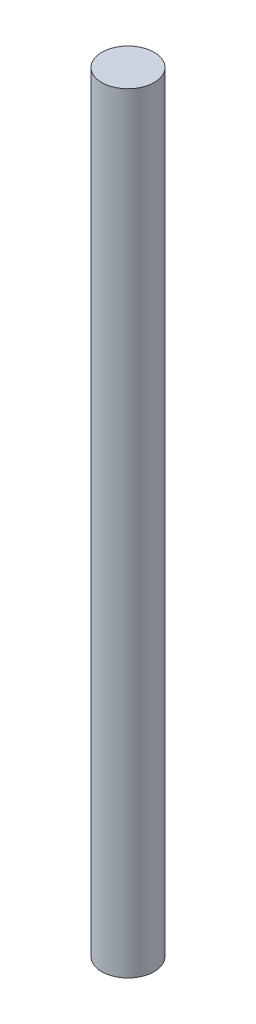
ISO-10303-21;
HEADER;
FILE_DESCRIPTION(('STEP AP214'),'2;1');
FILE_NAME('part.step','',(''),(''),'','','');
FILE_SCHEMA(('AUTOMOTIVE_DESIGN { 1 0 10303 214 1 1 1 1 }'));
ENDSEC;
DATA;
#1=APPLICATION_CONTEXT('core data for automotive mechanical design processes');
#2=APPLICATION_PROTOCOL_DEFINITION('international standard','automotive_design',2000,#1);
#3=PRODUCT_CONTEXT('',#1,'mechanical');
#4=PRODUCT('Part','Part','',(#3));
#5=PRODUCT_RELATED_PRODUCT_CATEGORY('part','',(#4));
#6=PRODUCT_DEFINITION_FORMATION('','',#4);
#7=PRODUCT_DEFINITION_CONTEXT('part definition',#1,'design');
#8=PRODUCT_DEFINITION('design','',#6,#7);
#9=PRODUCT_DEFINITION_SHAPE('','',#8);
#10=(LENGTH_UNIT() NAMED_UNIT(*) SI_UNIT(.MILLI.,.METRE.));
#11=(NAMED_UNIT(*) PLANE_ANGLE_UNIT() SI_UNIT($,.RADIAN.));
#12=(NAMED_UNIT(*) SI_UNIT($,.STERADIAN.) SOLID_ANGLE_UNIT());
#13=UNCERTAINTY_MEASURE_WITH_UNIT(LENGTH_MEASURE(1.E-05),#10,'distance_accuracy_value','');
#14=(GEOMETRIC_REPRESENTATION_CONTEXT(3) GLOBAL_UNCERTAINTY_ASSIGNED_CONTEXT((#13)) GLOBAL_UNIT_ASSIGNED_CONTEXT((#10,
#11,#12)) REPRESENTATION_CONTEXT('',''));
#15=CARTESIAN_POINT('',(0.,0.,0.));
#16=DIRECTION('',(0.,0.,1.));
#17=DIRECTION('',(1.,0.,0.));
#18=AXIS2_PLACEMENT_3D('',#15,#16,#17);
#19=CARTESIAN_POINT('',(0.,140.,0.));
#20=DIRECTION('',(0.,-1.,0.));
#21=DIRECTION('',(0.,0.,-1.));
#22=AXIS2_PLACEMENT_3D('',#19,#20,#21);
#23=CYLINDRICAL_SURFACE('',#22,4.7625);
#24=CARTESIAN_POINT('',(0.,140.,0.));
#25=DIRECTION('',(0.,1.,0.));
#26=DIRECTION('',(0.,0.,1.));
#27=AXIS2_PLACEMENT_3D('',#24,#25,#26);
#28=CIRCLE('',#27,4.7625);
#29=CARTESIAN_POINT('',(0.,140.,4.7625));
#30=VERTEX_POINT('',#29);
#31=EDGE_CURVE('E10',#30,#30,#28,.T.);
#32=ORIENTED_EDGE('',*,*,#31,.F.);
#33=EDGE_LOOP('',(#32));
#34=FACE_BOUND('',#33,.T.);
#35=CARTESIAN_POINT('',(0.,0.,0.));
#36=DIRECTION('',(0.,1.,0.));
#37=DIRECTION('',(0.,0.,1.));
#38=AXIS2_PLACEMENT_3D('',#35,#36,#37);
#39=CIRCLE('',#38,4.7625);
#40=CARTESIAN_POINT('',(0.,0.,4.7625));
#41=VERTEX_POINT('',#40);
#42=EDGE_CURVE('E38',#41,#41,#39,.T.);
#43=ORIENTED_EDGE('',*,*,#42,.T.);
#44=EDGE_LOOP('',(#43));
#45=FACE_BOUND('',#44,.T.);
#46=ADVANCED_FACE('F35',(#34,#45),#23,.T.);
#47=CARTESIAN_POINT('',(0.,140.,0.));
#48=DIRECTION('',(0.,1.,0.));
#49=DIRECTION('',(0.,0.,1.));
#50=AXIS2_PLACEMENT_3D('',#47,#48,#49);
#51=PLANE('',#50);
#52=ORIENTED_EDGE('',*,*,#31,.T.);
#53=EDGE_LOOP('',(#52));
#54=FACE_BOUND('',#53,.T.);
#55=ADVANCED_FACE('F64',(#54),#51,.T.);
#56=CARTESIAN_POINT('',(0.,0.,0.));
#57=DIRECTION('',(0.,1.,0.));
#58=DIRECTION('',(0.,0.,1.));
#59=AXIS2_PLACEMENT_3D('',#56,#57,#58);
#60=PLANE('',#59);
#61=CARTESIAN_POINT('',(0.,0.,0.));
#62=DIRECTION('',(0.,-1.,0.));
#63=DIRECTION('',(0.,0.,-1.));
#64=AXIS2_PLACEMENT_3D('',#61,#62,#63);
#65=CIRCLE('',#64,1.55);
#66=CARTESIAN_POINT('',(0.,0.,-1.55));
#67=VERTEX_POINT('',#66);
#68=EDGE_CURVE('E47',#67,#67,#65,.T.);
#69=ORIENTED_EDGE('',*,*,#68,.F.);
#70=EDGE_LOOP('',(#69));
#71=FACE_BOUND('',#70,.T.);
#72=ORIENTED_EDGE('',*,*,#42,.F.);
#73=EDGE_LOOP('',(#72));
#74=FACE_BOUND('',#73,.T.);
#75=ADVANCED_FACE('F58',(#71,#74),#60,.F.);
#76=CARTESIAN_POINT('',(0.,9.2,0.));
#77=DIRECTION('',(0.,-1.,0.));
#78=DIRECTION('',(0.,0.,-1.));
#79=AXIS2_PLACEMENT_3D('',#76,#77,#78);
#80=CYLINDRICAL_SURFACE('',#79,1.55);
#81=CARTESIAN_POINT('',(0.,9.2,0.));
#82=DIRECTION('',(0.,-1.,0.));
#83=DIRECTION('',(0.,0.,-1.));
#84=AXIS2_PLACEMENT_3D('',#81,#82,#83);
#85=CIRCLE('',#84,1.55);
#86=CARTESIAN_POINT('',(0.,9.2,-1.55));
#87=VERTEX_POINT('',#86);
#88=EDGE_CURVE('E45',#87,#87,#85,.T.);
#89=ORIENTED_EDGE('',*,*,#88,.F.);
#90=EDGE_LOOP('',(#89));
#91=FACE_BOUND('',#90,.T.);
#92=ORIENTED_EDGE('',*,*,#68,.T.);
#93=EDGE_LOOP('',(#92));
#94=FACE_BOUND('',#93,.T.);
#95=ADVANCED_FACE('F55',(#91,#94),#80,.F.);
#96=CARTESIAN_POINT('',(0.,9.2,0.));
#97=DIRECTION('',(0.,-1.,0.));
#98=DIRECTION('',(0.,0.,-1.));
#99=AXIS2_PLACEMENT_3D('',#96,#97,#98);
#100=PLANE('',#99);
#101=ORIENTED_EDGE('',*,*,#88,.T.);
#102=EDGE_LOOP('',(#101));
#103=FACE_BOUND('',#102,.T.);
#104=ADVANCED_FACE('F53',(#103),#100,.T.);
#105=CLOSED_SHELL('',(#46,#55,#75,#95,#104));
#106=MANIFOLD_SOLID_BREP('B2',#105);
#107=ADVANCED_BREP_SHAPE_REPRESENTATION('',(#18,#106),#14);
#108=SHAPE_DEFINITION_REPRESENTATION(#9,#107);
ENDSEC;
END-ISO-10303-21;
